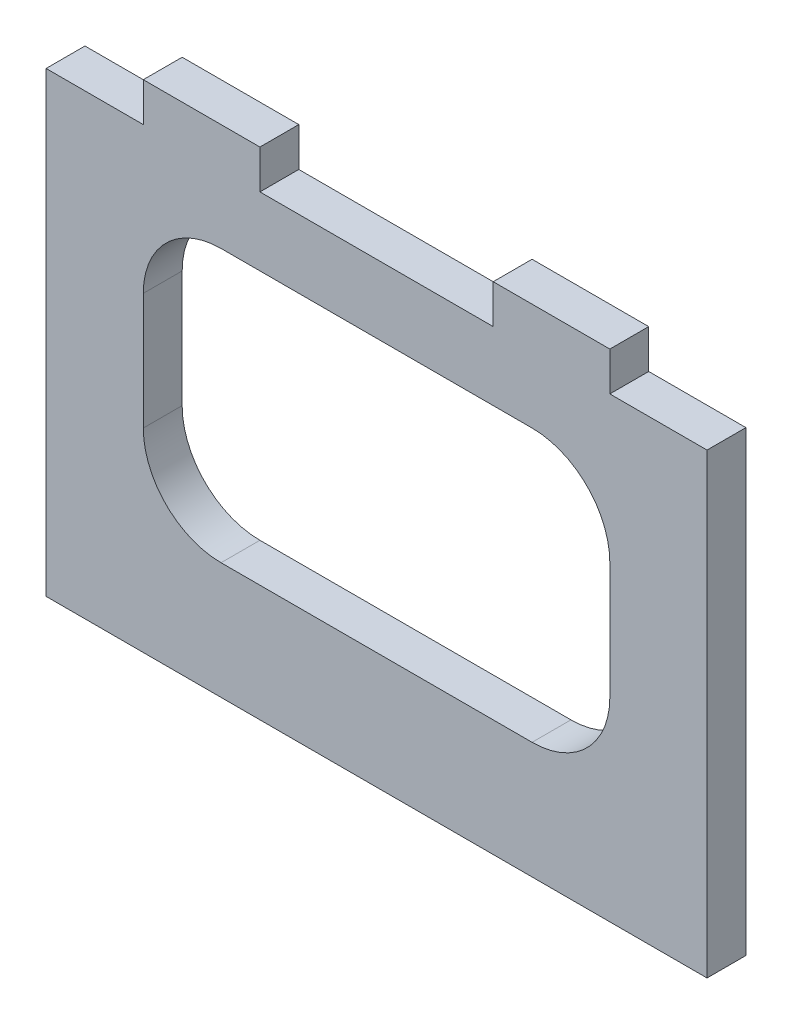
ISO-10303-21;
HEADER;
FILE_DESCRIPTION(('STEP AP214'),'2;1');
FILE_NAME('part.step','',(''),(''),'','','');
FILE_SCHEMA(('AUTOMOTIVE_DESIGN { 1 0 10303 214 1 1 1 1 }'));
ENDSEC;
DATA;
#1=APPLICATION_CONTEXT('core data for automotive mechanical design processes');
#2=APPLICATION_PROTOCOL_DEFINITION('international standard','automotive_design',2000,#1);
#3=PRODUCT_CONTEXT('',#1,'mechanical');
#4=PRODUCT('Part','Part','',(#3));
#5=PRODUCT_RELATED_PRODUCT_CATEGORY('part','',(#4));
#6=PRODUCT_DEFINITION_FORMATION('','',#4);
#7=PRODUCT_DEFINITION_CONTEXT('part definition',#1,'design');
#8=PRODUCT_DEFINITION('design','',#6,#7);
#9=PRODUCT_DEFINITION_SHAPE('','',#8);
#10=(LENGTH_UNIT() NAMED_UNIT(*) SI_UNIT(.MILLI.,.METRE.));
#11=(NAMED_UNIT(*) PLANE_ANGLE_UNIT() SI_UNIT($,.RADIAN.));
#12=(NAMED_UNIT(*) SI_UNIT($,.STERADIAN.) SOLID_ANGLE_UNIT());
#13=UNCERTAINTY_MEASURE_WITH_UNIT(LENGTH_MEASURE(1.E-05),#10,'distance_accuracy_value','');
#14=(GEOMETRIC_REPRESENTATION_CONTEXT(3) GLOBAL_UNCERTAINTY_ASSIGNED_CONTEXT((#13)) GLOBAL_UNIT_ASSIGNED_CONTEXT((#10,
#11,#12)) REPRESENTATION_CONTEXT('',''));
#15=CARTESIAN_POINT('',(0.,0.,0.));
#16=DIRECTION('',(0.,0.,1.));
#17=DIRECTION('',(1.,0.,0.));
#18=AXIS2_PLACEMENT_3D('',#15,#16,#17);
#19=CARTESIAN_POINT('',(0.,58.8,5.));
#20=DIRECTION('',(0.,-1.,0.));
#21=DIRECTION('',(0.,0.,-1.));
#22=AXIS2_PLACEMENT_3D('',#19,#20,#21);
#23=PLANE('',#22);
#24=DIRECTION('',(0.,0.,1.));
#25=VECTOR('',#24,1.);
#26=CARTESIAN_POINT('',(57.5,58.8,0.));
#27=LINE('',#26,#25);
#28=CARTESIAN_POINT('',(57.5,58.8,0.));
#29=VERTEX_POINT('',#28);
#30=CARTESIAN_POINT('',(57.5,58.8,5.));
#31=VERTEX_POINT('',#30);
#32=EDGE_CURVE('E390',#29,#31,#27,.T.);
#33=ORIENTED_EDGE('',*,*,#32,.F.);
#34=DIRECTION('',(-1.,0.,0.));
#35=VECTOR('',#34,1.);
#36=CARTESIAN_POINT('',(0.,58.8,0.));
#37=LINE('',#36,#35);
#38=CARTESIAN_POINT('',(27.5,58.8,0.));
#39=VERTEX_POINT('',#38);
#40=EDGE_CURVE('E193',#29,#39,#37,.T.);
#41=ORIENTED_EDGE('',*,*,#40,.T.);
#42=DIRECTION('',(0.,0.,-1.));
#43=VECTOR('',#42,1.);
#44=CARTESIAN_POINT('',(27.5,58.8,0.));
#45=LINE('',#44,#43);
#46=CARTESIAN_POINT('',(27.5,58.8,5.));
#47=VERTEX_POINT('',#46);
#48=EDGE_CURVE('E197',#47,#39,#45,.T.);
#49=ORIENTED_EDGE('',*,*,#48,.F.);
#50=DIRECTION('',(-1.,0.,0.));
#51=VECTOR('',#50,1.);
#52=CARTESIAN_POINT('',(0.,58.8,5.));
#53=LINE('',#52,#51);
#54=EDGE_CURVE('E47',#31,#47,#53,.T.);
#55=ORIENTED_EDGE('',*,*,#54,.F.);
#56=EDGE_LOOP('',(#33,#41,#49,#55));
#57=FACE_BOUND('',#56,.T.);
#58=ADVANCED_FACE('F32',(#57),#23,.F.);
#59=DIRECTION('',(0.,0.,-1.));
#60=VECTOR('',#59,1.);
#61=CARTESIAN_POINT('',(72.5,58.8,0.));
#62=LINE('',#61,#60);
#63=CARTESIAN_POINT('',(72.5,58.8,5.));
#64=VERTEX_POINT('',#63);
#65=CARTESIAN_POINT('',(72.5,58.8,0.));
#66=VERTEX_POINT('',#65);
#67=EDGE_CURVE('E55',#64,#66,#62,.T.);
#68=ORIENTED_EDGE('',*,*,#67,.F.);
#69=CARTESIAN_POINT('',(85.,58.8,5.));
#70=VERTEX_POINT('',#69);
#71=EDGE_CURVE('E259',#70,#64,#53,.T.);
#72=ORIENTED_EDGE('',*,*,#71,.F.);
#73=DIRECTION('',(0.,0.,-1.));
#74=VECTOR('',#73,1.);
#75=CARTESIAN_POINT('',(85.,58.8,5.));
#76=LINE('',#75,#74);
#77=CARTESIAN_POINT('',(85.,58.8,0.));
#78=VERTEX_POINT('',#77);
#79=EDGE_CURVE('E272',#70,#78,#76,.T.);
#80=ORIENTED_EDGE('',*,*,#79,.T.);
#81=EDGE_CURVE('E254',#78,#66,#37,.T.);
#82=ORIENTED_EDGE('',*,*,#81,.T.);
#83=EDGE_LOOP('',(#68,#72,#80,#82));
#84=FACE_BOUND('',#83,.T.);
#85=ADVANCED_FACE('F359',(#84),#23,.F.);
#86=DIRECTION('',(0.,0.,1.));
#87=VECTOR('',#86,1.);
#88=CARTESIAN_POINT('',(12.5,58.8,0.));
#89=LINE('',#88,#87);
#90=CARTESIAN_POINT('',(12.5,58.8,0.));
#91=VERTEX_POINT('',#90);
#92=CARTESIAN_POINT('',(12.5,58.8,5.));
#93=VERTEX_POINT('',#92);
#94=EDGE_CURVE('E194',#91,#93,#89,.T.);
#95=ORIENTED_EDGE('',*,*,#94,.F.);
#96=CARTESIAN_POINT('',(0.,58.8,0.));
#97=VERTEX_POINT('',#96);
#98=EDGE_CURVE('E268',#91,#97,#37,.T.);
#99=ORIENTED_EDGE('',*,*,#98,.T.);
#100=DIRECTION('',(0.,0.,-1.));
#101=VECTOR('',#100,1.);
#102=CARTESIAN_POINT('',(0.,58.8,5.));
#103=LINE('',#102,#101);
#104=CARTESIAN_POINT('',(0.,58.8,5.));
#105=VERTEX_POINT('',#104);
#106=EDGE_CURVE('E261',#105,#97,#103,.T.);
#107=ORIENTED_EDGE('',*,*,#106,.F.);
#108=EDGE_CURVE('E258',#93,#105,#53,.T.);
#109=ORIENTED_EDGE('',*,*,#108,.F.);
#110=EDGE_LOOP('',(#95,#99,#107,#109));
#111=FACE_BOUND('',#110,.T.);
#112=ADVANCED_FACE('F361',(#111),#23,.F.);
#113=CARTESIAN_POINT('',(0.,0.,5.));
#114=DIRECTION('',(1.,0.,0.));
#115=DIRECTION('',(0.,0.,-1.));
#116=AXIS2_PLACEMENT_3D('',#113,#114,#115);
#117=PLANE('',#116);
#118=DIRECTION('',(0.,-1.,0.));
#119=VECTOR('',#118,1.);
#120=CARTESIAN_POINT('',(0.,0.,0.));
#121=LINE('',#120,#119);
#122=CARTESIAN_POINT('',(0.,0.,0.));
#123=VERTEX_POINT('',#122);
#124=EDGE_CURVE('E239',#97,#123,#121,.T.);
#125=ORIENTED_EDGE('',*,*,#124,.T.);
#126=DIRECTION('',(0.,0.,-1.));
#127=VECTOR('',#126,1.);
#128=CARTESIAN_POINT('',(0.,0.,5.));
#129=LINE('',#128,#127);
#130=CARTESIAN_POINT('',(0.,0.,5.));
#131=VERTEX_POINT('',#130);
#132=EDGE_CURVE('E278',#131,#123,#129,.T.);
#133=ORIENTED_EDGE('',*,*,#132,.F.);
#134=DIRECTION('',(0.,-1.,0.));
#135=VECTOR('',#134,1.);
#136=CARTESIAN_POINT('',(0.,0.,5.));
#137=LINE('',#136,#135);
#138=EDGE_CURVE('E250',#105,#131,#137,.T.);
#139=ORIENTED_EDGE('',*,*,#138,.F.);
#140=ORIENTED_EDGE('',*,*,#106,.T.);
#141=EDGE_LOOP('',(#125,#133,#139,#140));
#142=FACE_BOUND('',#141,.T.);
#143=ADVANCED_FACE('F368',(#142),#117,.F.);
#144=CARTESIAN_POINT('',(0.,0.,5.));
#145=DIRECTION('',(0.,1.,0.));
#146=DIRECTION('',(0.,0.,1.));
#147=AXIS2_PLACEMENT_3D('',#144,#145,#146);
#148=PLANE('',#147);
#149=DIRECTION('',(1.,0.,0.));
#150=VECTOR('',#149,1.);
#151=CARTESIAN_POINT('',(0.,0.,0.));
#152=LINE('',#151,#150);
#153=CARTESIAN_POINT('',(85.,0.,0.));
#154=VERTEX_POINT('',#153);
#155=EDGE_CURVE('E264',#123,#154,#152,.T.);
#156=ORIENTED_EDGE('',*,*,#155,.T.);
#157=DIRECTION('',(0.,0.,-1.));
#158=VECTOR('',#157,1.);
#159=CARTESIAN_POINT('',(85.,0.,5.));
#160=LINE('',#159,#158);
#161=CARTESIAN_POINT('',(85.,0.,5.));
#162=VERTEX_POINT('',#161);
#163=EDGE_CURVE('E275',#162,#154,#160,.T.);
#164=ORIENTED_EDGE('',*,*,#163,.F.);
#165=DIRECTION('',(1.,0.,0.));
#166=VECTOR('',#165,1.);
#167=CARTESIAN_POINT('',(0.,0.,5.));
#168=LINE('',#167,#166);
#169=EDGE_CURVE('E253',#131,#162,#168,.T.);
#170=ORIENTED_EDGE('',*,*,#169,.F.);
#171=ORIENTED_EDGE('',*,*,#132,.T.);
#172=EDGE_LOOP('',(#156,#164,#170,#171));
#173=FACE_BOUND('',#172,.T.);
#174=ADVANCED_FACE('F373',(#173),#148,.F.);
#175=CARTESIAN_POINT('',(85.,0.,5.));
#176=DIRECTION('',(-1.,0.,0.));
#177=DIRECTION('',(0.,0.,1.));
#178=AXIS2_PLACEMENT_3D('',#175,#176,#177);
#179=PLANE('',#178);
#180=DIRECTION('',(0.,1.,0.));
#181=VECTOR('',#180,1.);
#182=CARTESIAN_POINT('',(85.,0.,0.));
#183=LINE('',#182,#181);
#184=EDGE_CURVE('E266',#154,#78,#183,.T.);
#185=ORIENTED_EDGE('',*,*,#184,.T.);
#186=ORIENTED_EDGE('',*,*,#79,.F.);
#187=DIRECTION('',(0.,1.,0.));
#188=VECTOR('',#187,1.);
#189=CARTESIAN_POINT('',(85.,0.,5.));
#190=LINE('',#189,#188);
#191=EDGE_CURVE('E256',#162,#70,#190,.T.);
#192=ORIENTED_EDGE('',*,*,#191,.F.);
#193=ORIENTED_EDGE('',*,*,#163,.T.);
#194=EDGE_LOOP('',(#185,#186,#192,#193));
#195=FACE_BOUND('',#194,.T.);
#196=ADVANCED_FACE('F406',(#195),#179,.F.);
#197=CARTESIAN_POINT('',(0.,0.,5.));
#198=DIRECTION('',(0.,0.,-1.));
#199=DIRECTION('',(-1.,0.,0.));
#200=AXIS2_PLACEMENT_3D('',#197,#198,#199);
#201=PLANE('',#200);
#202=DIRECTION('',(1.,0.,0.));
#203=VECTOR('',#202,1.);
#204=CARTESIAN_POINT('',(12.5,15.,5.));
#205=LINE('',#204,#203);
#206=CARTESIAN_POINT('',(22.5,15.,5.));
#207=VERTEX_POINT('',#206);
#208=CARTESIAN_POINT('',(62.5,15.,5.));
#209=VERTEX_POINT('',#208);
#210=EDGE_CURVE('E242',#207,#209,#205,.T.);
#211=ORIENTED_EDGE('',*,*,#210,.F.);
#212=CARTESIAN_POINT('',(22.5,25.,5.));
#213=DIRECTION('',(0.,0.,-1.));
#214=DIRECTION('',(-1.,0.,0.));
#215=AXIS2_PLACEMENT_3D('',#212,#213,#214);
#216=CIRCLE('',#215,10.);
#217=CARTESIAN_POINT('',(12.5,25.,5.));
#218=VERTEX_POINT('',#217);
#219=EDGE_CURVE('E301',#207,#218,#216,.T.);
#220=ORIENTED_EDGE('',*,*,#219,.T.);
#221=DIRECTION('',(0.,-1.,0.));
#222=VECTOR('',#221,1.);
#223=CARTESIAN_POINT('',(12.5,50.,5.));
#224=LINE('',#223,#222);
#225=CARTESIAN_POINT('',(12.5,40.,5.));
#226=VERTEX_POINT('',#225);
#227=EDGE_CURVE('E225',#226,#218,#224,.T.);
#228=ORIENTED_EDGE('',*,*,#227,.F.);
#229=CARTESIAN_POINT('',(22.5,40.,5.));
#230=DIRECTION('',(0.,0.,-1.));
#231=DIRECTION('',(-1.,0.,0.));
#232=AXIS2_PLACEMENT_3D('',#229,#230,#231);
#233=CIRCLE('',#232,10.);
#234=CARTESIAN_POINT('',(22.5,50.,5.));
#235=VERTEX_POINT('',#234);
#236=EDGE_CURVE('E40',#226,#235,#233,.T.);
#237=ORIENTED_EDGE('',*,*,#236,.T.);
#238=DIRECTION('',(-1.,0.,0.));
#239=VECTOR('',#238,1.);
#240=CARTESIAN_POINT('',(12.5,50.,5.));
#241=LINE('',#240,#239);
#242=CARTESIAN_POINT('',(62.5,50.,5.));
#243=VERTEX_POINT('',#242);
#244=EDGE_CURVE('E230',#243,#235,#241,.T.);
#245=ORIENTED_EDGE('',*,*,#244,.F.);
#246=CARTESIAN_POINT('',(62.5,40.,5.));
#247=DIRECTION('',(0.,0.,-1.));
#248=DIRECTION('',(-1.,0.,0.));
#249=AXIS2_PLACEMENT_3D('',#246,#247,#248);
#250=CIRCLE('',#249,10.);
#251=CARTESIAN_POINT('',(72.5,40.,5.));
#252=VERTEX_POINT('',#251);
#253=EDGE_CURVE('E309',#243,#252,#250,.T.);
#254=ORIENTED_EDGE('',*,*,#253,.T.);
#255=DIRECTION('',(0.,1.,0.));
#256=VECTOR('',#255,1.);
#257=CARTESIAN_POINT('',(72.5,50.,5.));
#258=LINE('',#257,#256);
#259=CARTESIAN_POINT('',(72.5,25.,5.));
#260=VERTEX_POINT('',#259);
#261=EDGE_CURVE('E245',#260,#252,#258,.T.);
#262=ORIENTED_EDGE('',*,*,#261,.F.);
#263=CARTESIAN_POINT('',(62.5,25.,5.));
#264=DIRECTION('',(0.,0.,-1.));
#265=DIRECTION('',(-1.,0.,0.));
#266=AXIS2_PLACEMENT_3D('',#263,#264,#265);
#267=CIRCLE('',#266,10.);
#268=EDGE_CURVE('E305',#260,#209,#267,.T.);
#269=ORIENTED_EDGE('',*,*,#268,.T.);
#270=EDGE_LOOP('',(#211,#220,#228,#237,#245,#254,#262,#269));
#271=FACE_BOUND('',#270,.T.);
#272=ORIENTED_EDGE('',*,*,#138,.T.);
#273=ORIENTED_EDGE('',*,*,#169,.T.);
#274=ORIENTED_EDGE('',*,*,#191,.T.);
#275=ORIENTED_EDGE('',*,*,#71,.T.);
#276=DIRECTION('',(0.,-1.,0.));
#277=VECTOR('',#276,1.);
#278=CARTESIAN_POINT('',(72.5,63.8,4.99999999999999));
#279=LINE('',#278,#277);
#280=CARTESIAN_POINT('',(72.5,63.8,4.99999999999999));
#281=VERTEX_POINT('',#280);
#282=EDGE_CURVE('E199',#281,#64,#279,.T.);
#283=ORIENTED_EDGE('',*,*,#282,.F.);
#284=DIRECTION('',(1.,0.,0.));
#285=VECTOR('',#284,1.);
#286=CARTESIAN_POINT('',(72.5,63.8,4.99999999999999));
#287=LINE('',#286,#285);
#288=CARTESIAN_POINT('',(57.5,63.8,4.99999999999999));
#289=VERTEX_POINT('',#288);
#290=EDGE_CURVE('E179',#289,#281,#287,.T.);
#291=ORIENTED_EDGE('',*,*,#290,.F.);
#292=DIRECTION('',(0.,-1.,0.));
#293=VECTOR('',#292,1.);
#294=CARTESIAN_POINT('',(57.5,63.8,4.99999999999999));
#295=LINE('',#294,#293);
#296=EDGE_CURVE('E176',#289,#31,#295,.T.);
#297=ORIENTED_EDGE('',*,*,#296,.T.);
#298=ORIENTED_EDGE('',*,*,#54,.T.);
#299=DIRECTION('',(0.,-1.,0.));
#300=VECTOR('',#299,1.);
#301=CARTESIAN_POINT('',(27.5,63.8,5.));
#302=LINE('',#301,#300);
#303=CARTESIAN_POINT('',(27.5,63.8,5.));
#304=VERTEX_POINT('',#303);
#305=EDGE_CURVE('E219',#304,#47,#302,.T.);
#306=ORIENTED_EDGE('',*,*,#305,.F.);
#307=DIRECTION('',(1.,0.,0.));
#308=VECTOR('',#307,1.);
#309=CARTESIAN_POINT('',(12.5,63.8,5.));
#310=LINE('',#309,#308);
#311=CARTESIAN_POINT('',(12.5,63.8,5.));
#312=VERTEX_POINT('',#311);
#313=EDGE_CURVE('E206',#312,#304,#310,.T.);
#314=ORIENTED_EDGE('',*,*,#313,.F.);
#315=DIRECTION('',(0.,-1.,0.));
#316=VECTOR('',#315,1.);
#317=CARTESIAN_POINT('',(12.5,63.8,5.));
#318=LINE('',#317,#316);
#319=EDGE_CURVE('E222',#312,#93,#318,.T.);
#320=ORIENTED_EDGE('',*,*,#319,.T.);
#321=ORIENTED_EDGE('',*,*,#108,.T.);
#322=EDGE_LOOP('',(#272,#273,#274,#275,#283,#291,#297,#298,#306,#314,#320,#321));
#323=FACE_BOUND('',#322,.T.);
#324=ADVANCED_FACE('F316',(#271,#323),#201,.F.);
#325=CARTESIAN_POINT('',(0.,0.,0.));
#326=DIRECTION('',(0.,0.,-1.));
#327=DIRECTION('',(-1.,0.,0.));
#328=AXIS2_PLACEMENT_3D('',#325,#326,#327);
#329=PLANE('',#328);
#330=DIRECTION('',(-1.,0.,0.));
#331=VECTOR('',#330,1.);
#332=CARTESIAN_POINT('',(12.5,50.,0.));
#333=LINE('',#332,#331);
#334=CARTESIAN_POINT('',(62.5,50.,0.));
#335=VERTEX_POINT('',#334);
#336=CARTESIAN_POINT('',(22.5,50.,0.));
#337=VERTEX_POINT('',#336);
#338=EDGE_CURVE('E236',#335,#337,#333,.T.);
#339=ORIENTED_EDGE('',*,*,#338,.T.);
#340=CARTESIAN_POINT('',(22.5,40.,0.));
#341=DIRECTION('',(0.,0.,-1.));
#342=DIRECTION('',(-1.,0.,0.));
#343=AXIS2_PLACEMENT_3D('',#340,#341,#342);
#344=CIRCLE('',#343,10.);
#345=CARTESIAN_POINT('',(12.5,40.,0.));
#346=VERTEX_POINT('',#345);
#347=EDGE_CURVE('E11',#337,#346,#344,.F.);
#348=ORIENTED_EDGE('',*,*,#347,.T.);
#349=DIRECTION('',(0.,-1.,0.));
#350=VECTOR('',#349,1.);
#351=CARTESIAN_POINT('',(12.5,50.,0.));
#352=LINE('',#351,#350);
#353=CARTESIAN_POINT('',(12.5,25.,0.));
#354=VERTEX_POINT('',#353);
#355=EDGE_CURVE('E226',#346,#354,#352,.T.);
#356=ORIENTED_EDGE('',*,*,#355,.T.);
#357=CARTESIAN_POINT('',(22.5,25.,0.));
#358=DIRECTION('',(0.,0.,-1.));
#359=DIRECTION('',(-1.,0.,0.));
#360=AXIS2_PLACEMENT_3D('',#357,#358,#359);
#361=CIRCLE('',#360,10.);
#362=CARTESIAN_POINT('',(22.5,15.,0.));
#363=VERTEX_POINT('',#362);
#364=EDGE_CURVE('E303',#354,#363,#361,.F.);
#365=ORIENTED_EDGE('',*,*,#364,.T.);
#366=DIRECTION('',(1.,0.,0.));
#367=VECTOR('',#366,1.);
#368=CARTESIAN_POINT('',(12.5,15.,0.));
#369=LINE('',#368,#367);
#370=CARTESIAN_POINT('',(62.5,15.,0.));
#371=VERTEX_POINT('',#370);
#372=EDGE_CURVE('E229',#363,#371,#369,.T.);
#373=ORIENTED_EDGE('',*,*,#372,.T.);
#374=CARTESIAN_POINT('',(62.5,25.,0.));
#375=DIRECTION('',(0.,0.,-1.));
#376=DIRECTION('',(-1.,0.,0.));
#377=AXIS2_PLACEMENT_3D('',#374,#375,#376);
#378=CIRCLE('',#377,10.);
#379=CARTESIAN_POINT('',(72.5,25.,0.));
#380=VERTEX_POINT('',#379);
#381=EDGE_CURVE('E307',#371,#380,#378,.F.);
#382=ORIENTED_EDGE('',*,*,#381,.T.);
#383=DIRECTION('',(0.,1.,0.));
#384=VECTOR('',#383,1.);
#385=CARTESIAN_POINT('',(72.5,50.,0.));
#386=LINE('',#385,#384);
#387=CARTESIAN_POINT('',(72.5,40.,0.));
#388=VERTEX_POINT('',#387);
#389=EDGE_CURVE('E233',#380,#388,#386,.T.);
#390=ORIENTED_EDGE('',*,*,#389,.T.);
#391=CARTESIAN_POINT('',(62.5,40.,0.));
#392=DIRECTION('',(0.,0.,-1.));
#393=DIRECTION('',(-1.,0.,0.));
#394=AXIS2_PLACEMENT_3D('',#391,#392,#393);
#395=CIRCLE('',#394,10.);
#396=EDGE_CURVE('E311',#388,#335,#395,.F.);
#397=ORIENTED_EDGE('',*,*,#396,.T.);
#398=EDGE_LOOP('',(#339,#348,#356,#365,#373,#382,#390,#397));
#399=FACE_BOUND('',#398,.T.);
#400=ORIENTED_EDGE('',*,*,#124,.F.);
#401=ORIENTED_EDGE('',*,*,#98,.F.);
#402=DIRECTION('',(0.,-1.,0.));
#403=VECTOR('',#402,1.);
#404=CARTESIAN_POINT('',(12.5,63.8,0.));
#405=LINE('',#404,#403);
#406=CARTESIAN_POINT('',(12.5,63.8,0.));
#407=VERTEX_POINT('',#406);
#408=EDGE_CURVE('E211',#407,#91,#405,.T.);
#409=ORIENTED_EDGE('',*,*,#408,.F.);
#410=DIRECTION('',(-1.,0.,0.));
#411=VECTOR('',#410,1.);
#412=CARTESIAN_POINT('',(12.5,63.8,0.));
#413=LINE('',#412,#411);
#414=CARTESIAN_POINT('',(27.5,63.8,0.));
#415=VERTEX_POINT('',#414);
#416=EDGE_CURVE('E210',#415,#407,#413,.T.);
#417=ORIENTED_EDGE('',*,*,#416,.F.);
#418=DIRECTION('',(0.,-1.,0.));
#419=VECTOR('',#418,1.);
#420=CARTESIAN_POINT('',(27.5,63.8,0.));
#421=LINE('',#420,#419);
#422=EDGE_CURVE('E217',#415,#39,#421,.T.);
#423=ORIENTED_EDGE('',*,*,#422,.T.);
#424=ORIENTED_EDGE('',*,*,#40,.F.);
#425=DIRECTION('',(0.,-1.,0.));
#426=VECTOR('',#425,1.);
#427=CARTESIAN_POINT('',(57.5,63.8,0.));
#428=LINE('',#427,#426);
#429=CARTESIAN_POINT('',(57.5,63.8,0.));
#430=VERTEX_POINT('',#429);
#431=EDGE_CURVE('E174',#430,#29,#428,.T.);
#432=ORIENTED_EDGE('',*,*,#431,.F.);
#433=DIRECTION('',(-1.,0.,0.));
#434=VECTOR('',#433,1.);
#435=CARTESIAN_POINT('',(72.5,63.8,0.));
#436=LINE('',#435,#434);
#437=CARTESIAN_POINT('',(72.5,63.8,0.));
#438=VERTEX_POINT('',#437);
#439=EDGE_CURVE('E180',#438,#430,#436,.T.);
#440=ORIENTED_EDGE('',*,*,#439,.F.);
#441=DIRECTION('',(0.,-1.,0.));
#442=VECTOR('',#441,1.);
#443=CARTESIAN_POINT('',(72.5,63.8,0.));
#444=LINE('',#443,#442);
#445=EDGE_CURVE('E396',#438,#66,#444,.T.);
#446=ORIENTED_EDGE('',*,*,#445,.T.);
#447=ORIENTED_EDGE('',*,*,#81,.F.);
#448=ORIENTED_EDGE('',*,*,#184,.F.);
#449=ORIENTED_EDGE('',*,*,#155,.F.);
#450=EDGE_LOOP('',(#400,#401,#409,#417,#423,#424,#432,#440,#446,#447,#448,#449));
#451=FACE_BOUND('',#450,.T.);
#452=ADVANCED_FACE('F191',(#399,#451),#329,.T.);
#453=CARTESIAN_POINT('',(12.5,50.,0.));
#454=DIRECTION('',(-1.,0.,0.));
#455=DIRECTION('',(0.,-1.,0.));
#456=AXIS2_PLACEMENT_3D('',#453,#454,#455);
#457=PLANE('',#456);
#458=ORIENTED_EDGE('',*,*,#227,.T.);
#459=DIRECTION('',(0.,0.,1.));
#460=VECTOR('',#459,1.);
#461=CARTESIAN_POINT('',(12.5,25.,0.));
#462=LINE('',#461,#460);
#463=EDGE_CURVE('E289',#218,#354,#462,.F.);
#464=ORIENTED_EDGE('',*,*,#463,.T.);
#465=ORIENTED_EDGE('',*,*,#355,.F.);
#466=DIRECTION('',(0.,0.,1.));
#467=VECTOR('',#466,1.);
#468=CARTESIAN_POINT('',(12.5,40.,5.));
#469=LINE('',#468,#467);
#470=EDGE_CURVE('E286',#346,#226,#469,.T.);
#471=ORIENTED_EDGE('',*,*,#470,.T.);
#472=EDGE_LOOP('',(#458,#464,#465,#471));
#473=FACE_BOUND('',#472,.T.);
#474=ADVANCED_FACE('F330',(#473),#457,.F.);
#475=CARTESIAN_POINT('',(12.5,50.,0.));
#476=DIRECTION('',(0.,1.,0.));
#477=DIRECTION('',(-1.,0.,0.));
#478=AXIS2_PLACEMENT_3D('',#475,#476,#477);
#479=PLANE('',#478);
#480=ORIENTED_EDGE('',*,*,#338,.F.);
#481=DIRECTION('',(0.,0.,1.));
#482=VECTOR('',#481,1.);
#483=CARTESIAN_POINT('',(62.5,50.,5.));
#484=LINE('',#483,#482);
#485=EDGE_CURVE('E298',#335,#243,#484,.T.);
#486=ORIENTED_EDGE('',*,*,#485,.T.);
#487=ORIENTED_EDGE('',*,*,#244,.T.);
#488=DIRECTION('',(0.,0.,1.));
#489=VECTOR('',#488,1.);
#490=CARTESIAN_POINT('',(22.5,50.,0.));
#491=LINE('',#490,#489);
#492=EDGE_CURVE('E296',#235,#337,#491,.F.);
#493=ORIENTED_EDGE('',*,*,#492,.T.);
#494=EDGE_LOOP('',(#480,#486,#487,#493));
#495=FACE_BOUND('',#494,.T.);
#496=ADVANCED_FACE('F323',(#495),#479,.F.);
#497=CARTESIAN_POINT('',(72.5,50.,0.));
#498=DIRECTION('',(1.,0.,0.));
#499=DIRECTION('',(0.,0.,-1.));
#500=AXIS2_PLACEMENT_3D('',#497,#498,#499);
#501=PLANE('',#500);
#502=ORIENTED_EDGE('',*,*,#389,.F.);
#503=DIRECTION('',(0.,0.,1.));
#504=VECTOR('',#503,1.);
#505=CARTESIAN_POINT('',(72.5,25.,5.));
#506=LINE('',#505,#504);
#507=EDGE_CURVE('E293',#380,#260,#506,.T.);
#508=ORIENTED_EDGE('',*,*,#507,.T.);
#509=ORIENTED_EDGE('',*,*,#261,.T.);
#510=DIRECTION('',(0.,0.,1.));
#511=VECTOR('',#510,1.);
#512=CARTESIAN_POINT('',(72.5,40.,0.));
#513=LINE('',#512,#511);
#514=EDGE_CURVE('E291',#252,#388,#513,.F.);
#515=ORIENTED_EDGE('',*,*,#514,.T.);
#516=EDGE_LOOP('',(#502,#508,#509,#515));
#517=FACE_BOUND('',#516,.T.);
#518=ADVANCED_FACE('F346',(#517),#501,.F.);
#519=CARTESIAN_POINT('',(12.5,15.,0.));
#520=DIRECTION('',(0.,-1.,0.));
#521=DIRECTION('',(1.,0.,0.));
#522=AXIS2_PLACEMENT_3D('',#519,#520,#521);
#523=PLANE('',#522);
#524=ORIENTED_EDGE('',*,*,#372,.F.);
#525=DIRECTION('',(0.,0.,1.));
#526=VECTOR('',#525,1.);
#527=CARTESIAN_POINT('',(22.5,15.,5.));
#528=LINE('',#527,#526);
#529=EDGE_CURVE('E283',#363,#207,#528,.T.);
#530=ORIENTED_EDGE('',*,*,#529,.T.);
#531=ORIENTED_EDGE('',*,*,#210,.T.);
#532=DIRECTION('',(0.,0.,1.));
#533=VECTOR('',#532,1.);
#534=CARTESIAN_POINT('',(62.5,15.,0.));
#535=LINE('',#534,#533);
#536=EDGE_CURVE('E281',#209,#371,#535,.F.);
#537=ORIENTED_EDGE('',*,*,#536,.T.);
#538=EDGE_LOOP('',(#524,#530,#531,#537));
#539=FACE_BOUND('',#538,.T.);
#540=ADVANCED_FACE('F338',(#539),#523,.F.);
#541=CARTESIAN_POINT('',(22.5,25.,0.));
#542=DIRECTION('',(0.,0.,-1.));
#543=DIRECTION('',(-1.,0.,0.));
#544=AXIS2_PLACEMENT_3D('',#541,#542,#543);
#545=CYLINDRICAL_SURFACE('',#544,10.);
#546=ORIENTED_EDGE('',*,*,#364,.F.);
#547=ORIENTED_EDGE('',*,*,#463,.F.);
#548=ORIENTED_EDGE('',*,*,#219,.F.);
#549=ORIENTED_EDGE('',*,*,#529,.F.);
#550=EDGE_LOOP('',(#546,#547,#548,#549));
#551=FACE_BOUND('',#550,.T.);
#552=ADVANCED_FACE('F333',(#551),#545,.F.);
#553=CARTESIAN_POINT('',(62.5,25.,0.));
#554=DIRECTION('',(0.,0.,-1.));
#555=DIRECTION('',(-1.,0.,0.));
#556=AXIS2_PLACEMENT_3D('',#553,#554,#555);
#557=CYLINDRICAL_SURFACE('',#556,10.);
#558=ORIENTED_EDGE('',*,*,#381,.F.);
#559=ORIENTED_EDGE('',*,*,#536,.F.);
#560=ORIENTED_EDGE('',*,*,#268,.F.);
#561=ORIENTED_EDGE('',*,*,#507,.F.);
#562=EDGE_LOOP('',(#558,#559,#560,#561));
#563=FACE_BOUND('',#562,.T.);
#564=ADVANCED_FACE('F341',(#563),#557,.F.);
#565=CARTESIAN_POINT('',(62.5,40.,0.));
#566=DIRECTION('',(0.,0.,-1.));
#567=DIRECTION('',(-1.,0.,0.));
#568=AXIS2_PLACEMENT_3D('',#565,#566,#567);
#569=CYLINDRICAL_SURFACE('',#568,10.);
#570=ORIENTED_EDGE('',*,*,#396,.F.);
#571=ORIENTED_EDGE('',*,*,#514,.F.);
#572=ORIENTED_EDGE('',*,*,#253,.F.);
#573=ORIENTED_EDGE('',*,*,#485,.F.);
#574=EDGE_LOOP('',(#570,#571,#572,#573));
#575=FACE_BOUND('',#574,.T.);
#576=ADVANCED_FACE('F350',(#575),#569,.F.);
#577=CARTESIAN_POINT('',(22.5,40.,0.));
#578=DIRECTION('',(0.,0.,-1.));
#579=DIRECTION('',(-1.,0.,0.));
#580=AXIS2_PLACEMENT_3D('',#577,#578,#579);
#581=CYLINDRICAL_SURFACE('',#580,10.);
#582=ORIENTED_EDGE('',*,*,#347,.F.);
#583=ORIENTED_EDGE('',*,*,#492,.F.);
#584=ORIENTED_EDGE('',*,*,#236,.F.);
#585=ORIENTED_EDGE('',*,*,#470,.F.);
#586=EDGE_LOOP('',(#582,#583,#584,#585));
#587=FACE_BOUND('',#586,.T.);
#588=ADVANCED_FACE('F34',(#587),#581,.F.);
#589=CARTESIAN_POINT('',(12.5,63.8,0.));
#590=DIRECTION('',(1.,0.,0.));
#591=DIRECTION('',(0.,0.,-1.));
#592=AXIS2_PLACEMENT_3D('',#589,#590,#591);
#593=PLANE('',#592);
#594=ORIENTED_EDGE('',*,*,#94,.T.);
#595=ORIENTED_EDGE('',*,*,#319,.F.);
#596=DIRECTION('',(0.,0.,1.));
#597=VECTOR('',#596,1.);
#598=CARTESIAN_POINT('',(12.5,63.8,0.));
#599=LINE('',#598,#597);
#600=EDGE_CURVE('E203',#407,#312,#599,.T.);
#601=ORIENTED_EDGE('',*,*,#600,.F.);
#602=ORIENTED_EDGE('',*,*,#408,.T.);
#603=EDGE_LOOP('',(#594,#595,#601,#602));
#604=FACE_BOUND('',#603,.T.);
#605=ADVANCED_FACE('F356',(#604),#593,.F.);
#606=CARTESIAN_POINT('',(27.5,63.8,0.));
#607=DIRECTION('',(-1.,0.,0.));
#608=DIRECTION('',(0.,0.,1.));
#609=AXIS2_PLACEMENT_3D('',#606,#607,#608);
#610=PLANE('',#609);
#611=ORIENTED_EDGE('',*,*,#48,.T.);
#612=ORIENTED_EDGE('',*,*,#422,.F.);
#613=DIRECTION('',(0.,0.,-1.));
#614=VECTOR('',#613,1.);
#615=CARTESIAN_POINT('',(27.5,63.8,0.));
#616=LINE('',#615,#614);
#617=EDGE_CURVE('E208',#304,#415,#616,.T.);
#618=ORIENTED_EDGE('',*,*,#617,.F.);
#619=ORIENTED_EDGE('',*,*,#305,.T.);
#620=EDGE_LOOP('',(#611,#612,#618,#619));
#621=FACE_BOUND('',#620,.T.);
#622=ADVANCED_FACE('F389',(#621),#610,.F.);
#623=CARTESIAN_POINT('',(0.,63.8,0.));
#624=DIRECTION('',(0.,1.,0.));
#625=DIRECTION('',(0.,0.,1.));
#626=AXIS2_PLACEMENT_3D('',#623,#624,#625);
#627=PLANE('',#626);
#628=ORIENTED_EDGE('',*,*,#600,.T.);
#629=ORIENTED_EDGE('',*,*,#313,.T.);
#630=ORIENTED_EDGE('',*,*,#617,.T.);
#631=ORIENTED_EDGE('',*,*,#416,.T.);
#632=EDGE_LOOP('',(#628,#629,#630,#631));
#633=FACE_BOUND('',#632,.T.);
#634=ADVANCED_FACE('F384',(#633),#627,.T.);
#635=CARTESIAN_POINT('',(57.5,63.8,0.));
#636=DIRECTION('',(1.,0.,0.));
#637=DIRECTION('',(0.,0.,-1.));
#638=AXIS2_PLACEMENT_3D('',#635,#636,#637);
#639=PLANE('',#638);
#640=ORIENTED_EDGE('',*,*,#32,.T.);
#641=ORIENTED_EDGE('',*,*,#296,.F.);
#642=DIRECTION('',(0.,0.,1.));
#643=VECTOR('',#642,1.);
#644=CARTESIAN_POINT('',(57.5,63.8,0.));
#645=LINE('',#644,#643);
#646=EDGE_CURVE('E170',#430,#289,#645,.T.);
#647=ORIENTED_EDGE('',*,*,#646,.F.);
#648=ORIENTED_EDGE('',*,*,#431,.T.);
#649=EDGE_LOOP('',(#640,#641,#647,#648));
#650=FACE_BOUND('',#649,.T.);
#651=ADVANCED_FACE('F172',(#650),#639,.F.);
#652=CARTESIAN_POINT('',(72.5,63.8,0.));
#653=DIRECTION('',(-1.,0.,0.));
#654=DIRECTION('',(0.,0.,1.));
#655=AXIS2_PLACEMENT_3D('',#652,#653,#654);
#656=PLANE('',#655);
#657=ORIENTED_EDGE('',*,*,#67,.T.);
#658=ORIENTED_EDGE('',*,*,#445,.F.);
#659=DIRECTION('',(0.,0.,-1.));
#660=VECTOR('',#659,1.);
#661=CARTESIAN_POINT('',(72.5,63.8,0.));
#662=LINE('',#661,#660);
#663=EDGE_CURVE('E185',#281,#438,#662,.T.);
#664=ORIENTED_EDGE('',*,*,#663,.F.);
#665=ORIENTED_EDGE('',*,*,#282,.T.);
#666=EDGE_LOOP('',(#657,#658,#664,#665));
#667=FACE_BOUND('',#666,.T.);
#668=ADVANCED_FACE('F400',(#667),#656,.F.);
#669=CARTESIAN_POINT('',(0.,63.8,0.));
#670=DIRECTION('',(0.,1.,0.));
#671=DIRECTION('',(0.,0.,1.));
#672=AXIS2_PLACEMENT_3D('',#669,#670,#671);
#673=PLANE('',#672);
#674=ORIENTED_EDGE('',*,*,#439,.T.);
#675=ORIENTED_EDGE('',*,*,#646,.T.);
#676=ORIENTED_EDGE('',*,*,#290,.T.);
#677=ORIENTED_EDGE('',*,*,#663,.T.);
#678=EDGE_LOOP('',(#674,#675,#676,#677));
#679=FACE_BOUND('',#678,.T.);
#680=ADVANCED_FACE('F183',(#679),#673,.T.);
#681=CLOSED_SHELL('',(#58,#85,#112,#143,#174,#196,#324,#452,#474,#496,#518,#540,#552,#564,#576,
#588,#605,#622,#634,#651,#668,#680));
#682=MANIFOLD_SOLID_BREP('B2',#681);
#683=ADVANCED_BREP_SHAPE_REPRESENTATION('',(#18,#682),#14);
#684=SHAPE_DEFINITION_REPRESENTATION(#9,#683);
ENDSEC;
END-ISO-10303-21;
